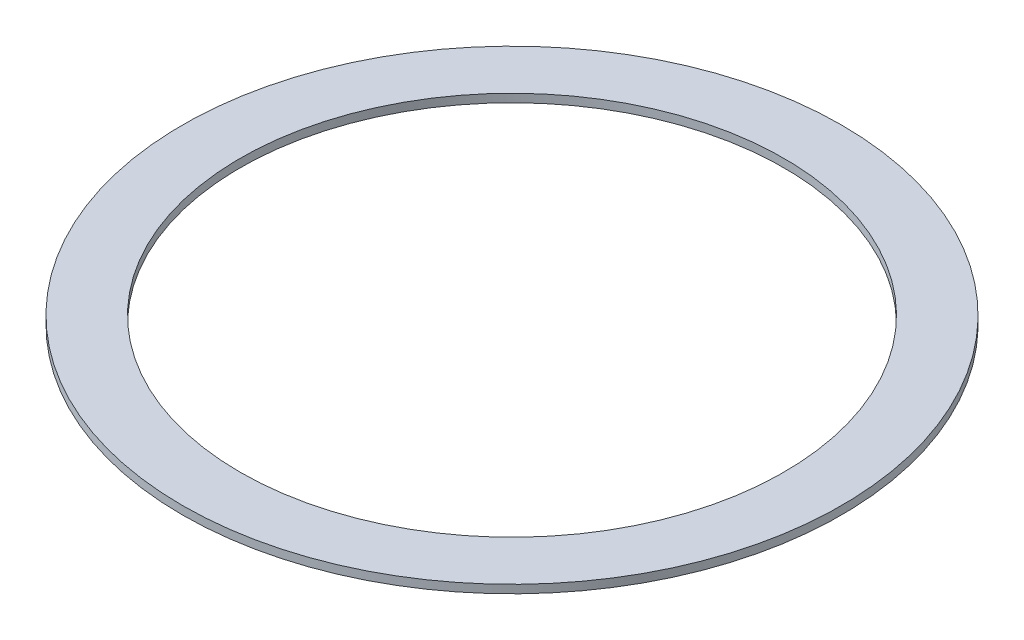
ISO-10303-21;
HEADER;
FILE_DESCRIPTION(('STEP AP214'),'2;1');
FILE_NAME('part.step','',(''),(''),'','','');
FILE_SCHEMA(('AUTOMOTIVE_DESIGN { 1 0 10303 214 1 1 1 1 }'));
ENDSEC;
DATA;
#1=APPLICATION_CONTEXT('core data for automotive mechanical design processes');
#2=APPLICATION_PROTOCOL_DEFINITION('international standard','automotive_design',2000,#1);
#3=PRODUCT_CONTEXT('',#1,'mechanical');
#4=PRODUCT('Part','Part','',(#3));
#5=PRODUCT_RELATED_PRODUCT_CATEGORY('part','',(#4));
#6=PRODUCT_DEFINITION_FORMATION('','',#4);
#7=PRODUCT_DEFINITION_CONTEXT('part definition',#1,'design');
#8=PRODUCT_DEFINITION('design','',#6,#7);
#9=PRODUCT_DEFINITION_SHAPE('','',#8);
#10=(LENGTH_UNIT() NAMED_UNIT(*) SI_UNIT(.MILLI.,.METRE.));
#11=(NAMED_UNIT(*) PLANE_ANGLE_UNIT() SI_UNIT($,.RADIAN.));
#12=(NAMED_UNIT(*) SI_UNIT($,.STERADIAN.) SOLID_ANGLE_UNIT());
#13=UNCERTAINTY_MEASURE_WITH_UNIT(LENGTH_MEASURE(1.E-05),#10,'distance_accuracy_value','');
#14=(GEOMETRIC_REPRESENTATION_CONTEXT(3) GLOBAL_UNCERTAINTY_ASSIGNED_CONTEXT((#13)) GLOBAL_UNIT_ASSIGNED_CONTEXT((#10,
#11,#12)) REPRESENTATION_CONTEXT('',''));
#15=CARTESIAN_POINT('',(0.,0.,0.));
#16=DIRECTION('',(0.,0.,1.));
#17=DIRECTION('',(1.,0.,0.));
#18=AXIS2_PLACEMENT_3D('',#15,#16,#17);
#19=CARTESIAN_POINT('',(0.,1.,0.));
#20=DIRECTION('',(0.,1.,0.));
#21=DIRECTION('',(0.,0.,1.));
#22=AXIS2_PLACEMENT_3D('',#19,#20,#21);
#23=PLANE('',#22);
#24=CARTESIAN_POINT('',(0.,1.,0.));
#25=DIRECTION('',(0.,1.,0.));
#26=DIRECTION('',(0.,0.,1.));
#27=AXIS2_PLACEMENT_3D('',#24,#25,#26);
#28=CIRCLE('',#27,40.);
#29=CARTESIAN_POINT('',(0.,1.,40.));
#30=VERTEX_POINT('',#29);
#31=EDGE_CURVE('E10',#30,#30,#28,.T.);
#32=ORIENTED_EDGE('',*,*,#31,.T.);
#33=EDGE_LOOP('',(#32));
#34=FACE_BOUND('',#33,.T.);
#35=CARTESIAN_POINT('',(0.,1.,0.));
#36=DIRECTION('',(0.,1.,0.));
#37=DIRECTION('',(0.,0.,1.));
#38=AXIS2_PLACEMENT_3D('',#35,#36,#37);
#39=CIRCLE('',#38,33.);
#40=CARTESIAN_POINT('',(0.,1.,33.));
#41=VERTEX_POINT('',#40);
#42=EDGE_CURVE('E41',#41,#41,#39,.T.);
#43=ORIENTED_EDGE('',*,*,#42,.F.);
#44=EDGE_LOOP('',(#43));
#45=FACE_BOUND('',#44,.T.);
#46=ADVANCED_FACE('F30',(#34,#45),#23,.T.);
#47=CARTESIAN_POINT('',(0.,0.,0.));
#48=DIRECTION('',(0.,1.,0.));
#49=DIRECTION('',(0.,0.,1.));
#50=AXIS2_PLACEMENT_3D('',#47,#48,#49);
#51=PLANE('',#50);
#52=CARTESIAN_POINT('',(0.,0.,0.));
#53=DIRECTION('',(0.,1.,0.));
#54=DIRECTION('',(0.,0.,1.));
#55=AXIS2_PLACEMENT_3D('',#52,#53,#54);
#56=CIRCLE('',#55,40.);
#57=CARTESIAN_POINT('',(0.,0.,40.));
#58=VERTEX_POINT('',#57);
#59=EDGE_CURVE('E34',#58,#58,#56,.T.);
#60=ORIENTED_EDGE('',*,*,#59,.F.);
#61=EDGE_LOOP('',(#60));
#62=FACE_BOUND('',#61,.T.);
#63=CARTESIAN_POINT('',(0.,0.,0.));
#64=DIRECTION('',(0.,1.,0.));
#65=DIRECTION('',(0.,0.,1.));
#66=AXIS2_PLACEMENT_3D('',#63,#64,#65);
#67=CIRCLE('',#66,33.);
#68=CARTESIAN_POINT('',(0.,0.,33.));
#69=VERTEX_POINT('',#68);
#70=EDGE_CURVE('E43',#69,#69,#67,.T.);
#71=ORIENTED_EDGE('',*,*,#70,.T.);
#72=EDGE_LOOP('',(#71));
#73=FACE_BOUND('',#72,.T.);
#74=ADVANCED_FACE('F53',(#62,#73),#51,.F.);
#75=CARTESIAN_POINT('',(0.,1.,0.));
#76=DIRECTION('',(0.,-1.,0.));
#77=DIRECTION('',(0.,0.,-1.));
#78=AXIS2_PLACEMENT_3D('',#75,#76,#77);
#79=CYLINDRICAL_SURFACE('',#78,40.);
#80=ORIENTED_EDGE('',*,*,#31,.F.);
#81=EDGE_LOOP('',(#80));
#82=FACE_BOUND('',#81,.T.);
#83=ORIENTED_EDGE('',*,*,#59,.T.);
#84=EDGE_LOOP('',(#83));
#85=FACE_BOUND('',#84,.T.);
#86=ADVANCED_FACE('F32',(#82,#85),#79,.T.);
#87=CARTESIAN_POINT('',(0.,1.,0.));
#88=DIRECTION('',(0.,-1.,0.));
#89=DIRECTION('',(0.,0.,-1.));
#90=AXIS2_PLACEMENT_3D('',#87,#88,#89);
#91=CYLINDRICAL_SURFACE('',#90,33.);
#92=ORIENTED_EDGE('',*,*,#42,.T.);
#93=EDGE_LOOP('',(#92));
#94=FACE_BOUND('',#93,.T.);
#95=ORIENTED_EDGE('',*,*,#70,.F.);
#96=EDGE_LOOP('',(#95));
#97=FACE_BOUND('',#96,.T.);
#98=ADVANCED_FACE('F49',(#94,#97),#91,.F.);
#99=CLOSED_SHELL('',(#46,#74,#86,#98));
#100=MANIFOLD_SOLID_BREP('B2',#99);
#101=ADVANCED_BREP_SHAPE_REPRESENTATION('',(#18,#100),#14);
#102=SHAPE_DEFINITION_REPRESENTATION(#9,#101);
ENDSEC;
END-ISO-10303-21;
